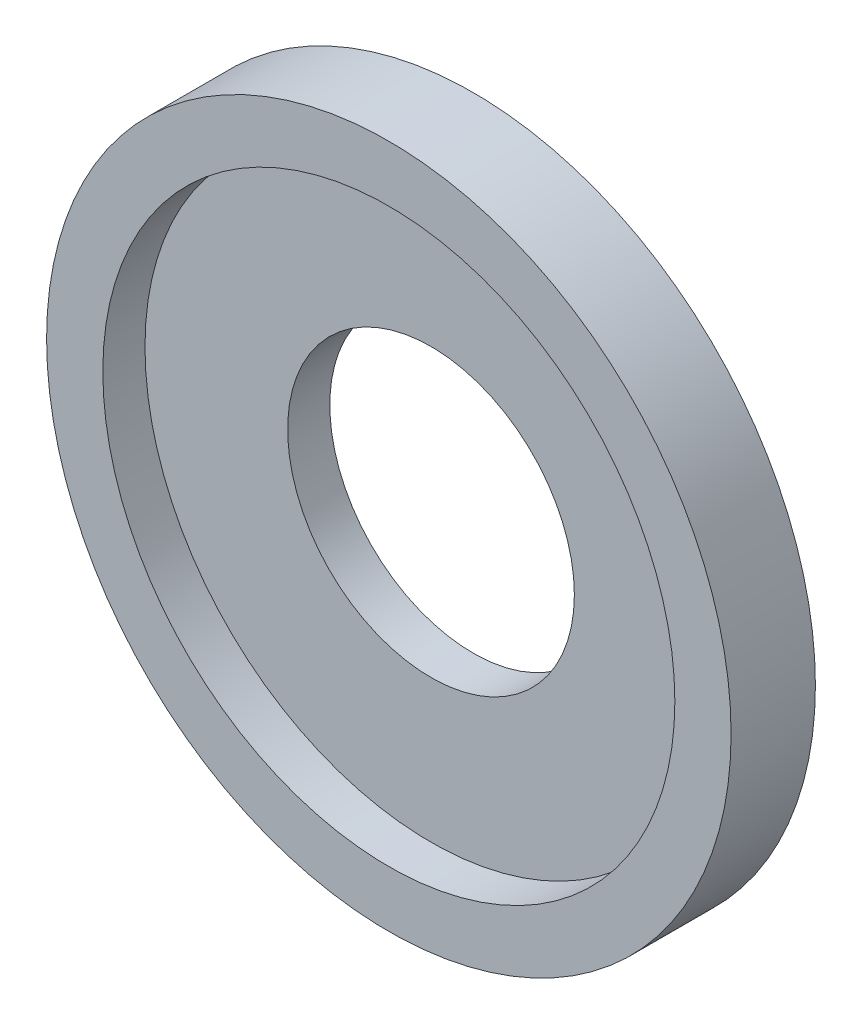
ISO-10303-21;
HEADER;
FILE_DESCRIPTION(('STEP AP214'),'2;1');
FILE_NAME('part.step','',(''),(''),'','','');
FILE_SCHEMA(('AUTOMOTIVE_DESIGN { 1 0 10303 214 1 1 1 1 }'));
ENDSEC;
DATA;
#1=APPLICATION_CONTEXT('core data for automotive mechanical design processes');
#2=APPLICATION_PROTOCOL_DEFINITION('international standard','automotive_design',2000,#1);
#3=PRODUCT_CONTEXT('',#1,'mechanical');
#4=PRODUCT('Part','Part','',(#3));
#5=PRODUCT_RELATED_PRODUCT_CATEGORY('part','',(#4));
#6=PRODUCT_DEFINITION_FORMATION('','',#4);
#7=PRODUCT_DEFINITION_CONTEXT('part definition',#1,'design');
#8=PRODUCT_DEFINITION('design','',#6,#7);
#9=PRODUCT_DEFINITION_SHAPE('','',#8);
#10=(LENGTH_UNIT() NAMED_UNIT(*) SI_UNIT(.MILLI.,.METRE.));
#11=(NAMED_UNIT(*) PLANE_ANGLE_UNIT() SI_UNIT($,.RADIAN.));
#12=(NAMED_UNIT(*) SI_UNIT($,.STERADIAN.) SOLID_ANGLE_UNIT());
#13=UNCERTAINTY_MEASURE_WITH_UNIT(LENGTH_MEASURE(1.E-05),#10,'distance_accuracy_value','');
#14=(GEOMETRIC_REPRESENTATION_CONTEXT(3) GLOBAL_UNCERTAINTY_ASSIGNED_CONTEXT((#13)) GLOBAL_UNIT_ASSIGNED_CONTEXT((#10,
#11,#12)) REPRESENTATION_CONTEXT('',''));
#15=CARTESIAN_POINT('',(0.,0.,0.));
#16=DIRECTION('',(0.,0.,1.));
#17=DIRECTION('',(1.,0.,0.));
#18=AXIS2_PLACEMENT_3D('',#15,#16,#17);
#19=CARTESIAN_POINT('',(0.,0.,3.));
#20=DIRECTION('',(0.,0.,1.));
#21=DIRECTION('',(1.,0.,0.));
#22=AXIS2_PLACEMENT_3D('',#19,#20,#21);
#23=PLANE('',#22);
#24=CARTESIAN_POINT('',(0.,0.,3.));
#25=DIRECTION('',(0.,0.,1.));
#26=DIRECTION('',(1.,0.,0.));
#27=AXIS2_PLACEMENT_3D('',#24,#25,#26);
#28=CIRCLE('',#27,12.175);
#29=CARTESIAN_POINT('',(12.175,0.,3.));
#30=VERTEX_POINT('',#29);
#31=EDGE_CURVE('E45',#30,#30,#28,.T.);
#32=ORIENTED_EDGE('',*,*,#31,.T.);
#33=EDGE_LOOP('',(#32));
#34=FACE_BOUND('',#33,.T.);
#35=CARTESIAN_POINT('',(0.,0.,3.));
#36=DIRECTION('',(0.,0.,1.));
#37=DIRECTION('',(1.,0.,0.));
#38=AXIS2_PLACEMENT_3D('',#35,#36,#37);
#39=CIRCLE('',#38,10.175);
#40=CARTESIAN_POINT('',(10.175,0.,3.));
#41=VERTEX_POINT('',#40);
#42=EDGE_CURVE('E56',#41,#41,#39,.T.);
#43=ORIENTED_EDGE('',*,*,#42,.F.);
#44=EDGE_LOOP('',(#43));
#45=FACE_BOUND('',#44,.T.);
#46=ADVANCED_FACE('F37',(#34,#45),#23,.T.);
#47=CARTESIAN_POINT('',(0.,0.,0.));
#48=DIRECTION('',(0.,0.,1.));
#49=DIRECTION('',(1.,0.,0.));
#50=AXIS2_PLACEMENT_3D('',#47,#48,#49);
#51=PLANE('',#50);
#52=CARTESIAN_POINT('',(0.,0.,0.));
#53=DIRECTION('',(0.,0.,1.));
#54=DIRECTION('',(1.,0.,0.));
#55=AXIS2_PLACEMENT_3D('',#52,#53,#54);
#56=CIRCLE('',#55,12.175);
#57=CARTESIAN_POINT('',(12.175,0.,0.));
#58=VERTEX_POINT('',#57);
#59=EDGE_CURVE('E50',#58,#58,#56,.T.);
#60=ORIENTED_EDGE('',*,*,#59,.F.);
#61=EDGE_LOOP('',(#60));
#62=FACE_BOUND('',#61,.T.);
#63=CARTESIAN_POINT('',(0.,0.,0.));
#64=DIRECTION('',(0.,0.,1.));
#65=DIRECTION('',(1.,0.,0.));
#66=AXIS2_PLACEMENT_3D('',#63,#64,#65);
#67=CIRCLE('',#66,5.1);
#68=CARTESIAN_POINT('',(5.1,0.,0.));
#69=VERTEX_POINT('',#68);
#70=EDGE_CURVE('E62',#69,#69,#67,.T.);
#71=ORIENTED_EDGE('',*,*,#70,.T.);
#72=EDGE_LOOP('',(#71));
#73=FACE_BOUND('',#72,.T.);
#74=ADVANCED_FACE('F85',(#62,#73),#51,.F.);
#75=CARTESIAN_POINT('',(0.,0.,3.));
#76=DIRECTION('',(0.,0.,-1.));
#77=DIRECTION('',(-1.,0.,0.));
#78=AXIS2_PLACEMENT_3D('',#75,#76,#77);
#79=CYLINDRICAL_SURFACE('',#78,12.175);
#80=ORIENTED_EDGE('',*,*,#31,.F.);
#81=EDGE_LOOP('',(#80));
#82=FACE_BOUND('',#81,.T.);
#83=ORIENTED_EDGE('',*,*,#59,.T.);
#84=EDGE_LOOP('',(#83));
#85=FACE_BOUND('',#84,.T.);
#86=ADVANCED_FACE('F39',(#82,#85),#79,.T.);
#87=CARTESIAN_POINT('',(0.,0.,3.));
#88=DIRECTION('',(0.,0.,-1.));
#89=DIRECTION('',(-1.,0.,0.));
#90=AXIS2_PLACEMENT_3D('',#87,#88,#89);
#91=CYLINDRICAL_SURFACE('',#90,10.175);
#92=CARTESIAN_POINT('',(0.,0.,1.5));
#93=DIRECTION('',(0.,0.,1.));
#94=DIRECTION('',(1.,0.,0.));
#95=AXIS2_PLACEMENT_3D('',#92,#93,#94);
#96=CIRCLE('',#95,10.175);
#97=CARTESIAN_POINT('',(10.175,0.,1.5));
#98=VERTEX_POINT('',#97);
#99=EDGE_CURVE('E10',#98,#98,#96,.T.);
#100=ORIENTED_EDGE('',*,*,#99,.F.);
#101=EDGE_LOOP('',(#100));
#102=FACE_BOUND('',#101,.T.);
#103=ORIENTED_EDGE('',*,*,#42,.T.);
#104=EDGE_LOOP('',(#103));
#105=FACE_BOUND('',#104,.T.);
#106=ADVANCED_FACE('F75',(#102,#105),#91,.F.);
#107=CARTESIAN_POINT('',(0.,0.,1.5));
#108=DIRECTION('',(0.,0.,1.));
#109=DIRECTION('',(1.,0.,0.));
#110=AXIS2_PLACEMENT_3D('',#107,#108,#109);
#111=PLANE('',#110);
#112=CARTESIAN_POINT('',(0.,0.,1.5));
#113=DIRECTION('',(0.,0.,1.));
#114=DIRECTION('',(1.,0.,0.));
#115=AXIS2_PLACEMENT_3D('',#112,#113,#114);
#116=CIRCLE('',#115,5.1);
#117=CARTESIAN_POINT('',(5.1,0.,1.5));
#118=VERTEX_POINT('',#117);
#119=EDGE_CURVE('E61',#118,#118,#116,.T.);
#120=ORIENTED_EDGE('',*,*,#119,.F.);
#121=EDGE_LOOP('',(#120));
#122=FACE_BOUND('',#121,.T.);
#123=ORIENTED_EDGE('',*,*,#99,.T.);
#124=EDGE_LOOP('',(#123));
#125=FACE_BOUND('',#124,.T.);
#126=ADVANCED_FACE('F73',(#122,#125),#111,.T.);
#127=CARTESIAN_POINT('',(0.,0.,1.5));
#128=DIRECTION('',(0.,0.,-1.));
#129=DIRECTION('',(-1.,0.,0.));
#130=AXIS2_PLACEMENT_3D('',#127,#128,#129);
#131=CYLINDRICAL_SURFACE('',#130,5.1);
#132=ORIENTED_EDGE('',*,*,#119,.T.);
#133=EDGE_LOOP('',(#132));
#134=FACE_BOUND('',#133,.T.);
#135=ORIENTED_EDGE('',*,*,#70,.F.);
#136=EDGE_LOOP('',(#135));
#137=FACE_BOUND('',#136,.T.);
#138=ADVANCED_FACE('F70',(#134,#137),#131,.F.);
#139=CLOSED_SHELL('',(#46,#74,#86,#106,#126,#138));
#140=MANIFOLD_SOLID_BREP('B2',#139);
#141=ADVANCED_BREP_SHAPE_REPRESENTATION('',(#18,#140),#14);
#142=SHAPE_DEFINITION_REPRESENTATION(#9,#141);
ENDSEC;
END-ISO-10303-21;
